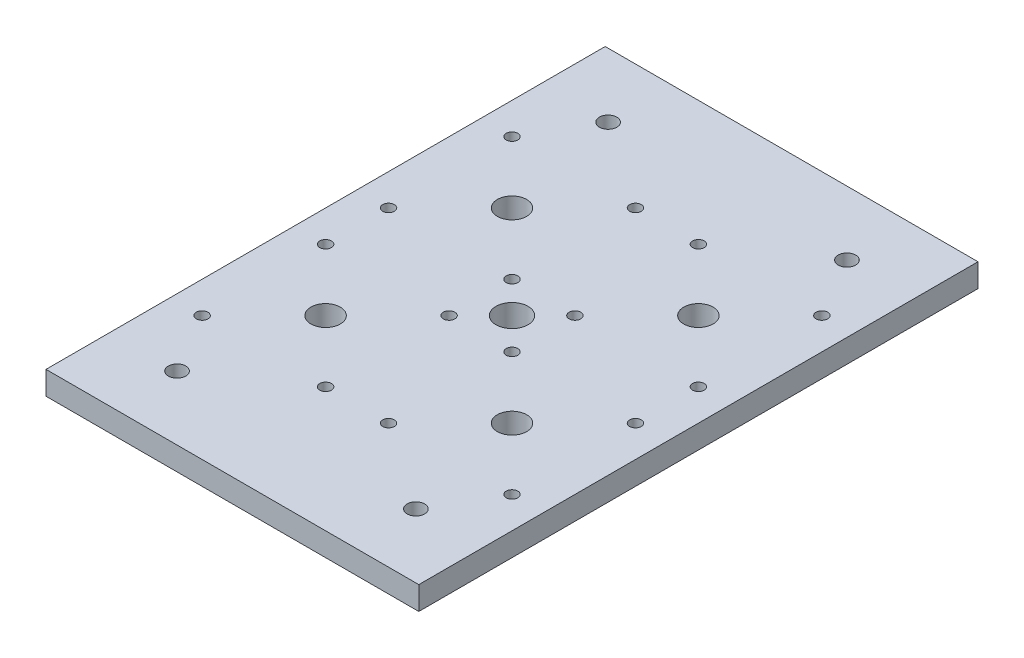
ISO-10303-21;
HEADER;
FILE_DESCRIPTION(('STEP AP214'),'2;1');
FILE_NAME('part.step','',(''),(''),'','','');
FILE_SCHEMA(('AUTOMOTIVE_DESIGN { 1 0 10303 214 1 1 1 1 }'));
ENDSEC;
DATA;
#1=APPLICATION_CONTEXT('core data for automotive mechanical design processes');
#2=APPLICATION_PROTOCOL_DEFINITION('international standard','automotive_design',2000,#1);
#3=PRODUCT_CONTEXT('',#1,'mechanical');
#4=PRODUCT('Part','Part','',(#3));
#5=PRODUCT_RELATED_PRODUCT_CATEGORY('part','',(#4));
#6=PRODUCT_DEFINITION_FORMATION('','',#4);
#7=PRODUCT_DEFINITION_CONTEXT('part definition',#1,'design');
#8=PRODUCT_DEFINITION('design','',#6,#7);
#9=PRODUCT_DEFINITION_SHAPE('','',#8);
#10=(LENGTH_UNIT() NAMED_UNIT(*) SI_UNIT(.MILLI.,.METRE.));
#11=(NAMED_UNIT(*) PLANE_ANGLE_UNIT() SI_UNIT($,.RADIAN.));
#12=(NAMED_UNIT(*) SI_UNIT($,.STERADIAN.) SOLID_ANGLE_UNIT());
#13=UNCERTAINTY_MEASURE_WITH_UNIT(LENGTH_MEASURE(1.E-05),#10,'distance_accuracy_value','');
#14=(GEOMETRIC_REPRESENTATION_CONTEXT(3) GLOBAL_UNCERTAINTY_ASSIGNED_CONTEXT((#13)) GLOBAL_UNIT_ASSIGNED_CONTEXT((#10,
#11,#12)) REPRESENTATION_CONTEXT('',''));
#15=CARTESIAN_POINT('',(0.,0.,0.));
#16=DIRECTION('',(0.,0.,1.));
#17=DIRECTION('',(1.,0.,0.));
#18=AXIS2_PLACEMENT_3D('',#15,#16,#17);
#19=CARTESIAN_POINT('',(0.,6.35,0.));
#20=DIRECTION('',(0.,1.,0.));
#21=DIRECTION('',(0.,0.,1.));
#22=AXIS2_PLACEMENT_3D('',#19,#20,#21);
#23=PLANE('',#22);
#24=CARTESIAN_POINT('',(-32.54375,6.35,58.7375));
#25=DIRECTION('',(0.,1.,0.));
#26=DIRECTION('',(0.,0.,1.));
#27=AXIS2_PLACEMENT_3D('',#24,#25,#26);
#28=CIRCLE('',#27,2.38125);
#29=CARTESIAN_POINT('',(-32.54375,6.35,61.11875));
#30=VERTEX_POINT('',#29);
#31=EDGE_CURVE('E247',#30,#30,#28,.T.);
#32=ORIENTED_EDGE('',*,*,#31,.F.);
#33=EDGE_LOOP('',(#32));
#34=FACE_BOUND('',#33,.T.);
#35=CARTESIAN_POINT('',(32.54375,6.35,-58.7375));
#36=DIRECTION('',(0.,1.,0.));
#37=DIRECTION('',(0.,0.,1.));
#38=AXIS2_PLACEMENT_3D('',#35,#36,#37);
#39=CIRCLE('',#38,2.38125);
#40=CARTESIAN_POINT('',(32.54375,6.35,-56.35625));
#41=VERTEX_POINT('',#40);
#42=EDGE_CURVE('E235',#41,#41,#39,.T.);
#43=ORIENTED_EDGE('',*,*,#42,.F.);
#44=EDGE_LOOP('',(#43));
#45=FACE_BOUND('',#44,.T.);
#46=CARTESIAN_POINT('',(-42.225,6.35,42.225));
#47=DIRECTION('',(0.,1.,0.));
#48=DIRECTION('',(0.,0.,-1.));
#49=AXIS2_PLACEMENT_3D('',#46,#47,#48);
#50=CIRCLE('',#49,1.5875);
#51=CARTESIAN_POINT('',(-42.225,6.35,40.6375));
#52=VERTEX_POINT('',#51);
#53=EDGE_CURVE('E223',#52,#52,#50,.T.);
#54=ORIENTED_EDGE('',*,*,#53,.F.);
#55=EDGE_LOOP('',(#54));
#56=FACE_BOUND('',#55,.T.);
#57=CARTESIAN_POINT('',(-8.57499999999998,6.35,42.225));
#58=DIRECTION('',(0.,1.,0.));
#59=DIRECTION('',(0.,0.,1.));
#60=AXIS2_PLACEMENT_3D('',#57,#58,#59);
#61=CIRCLE('',#60,1.5875);
#62=CARTESIAN_POINT('',(-8.57499999999998,6.35,43.8125));
#63=VERTEX_POINT('',#62);
#64=EDGE_CURVE('E211',#63,#63,#61,.T.);
#65=ORIENTED_EDGE('',*,*,#64,.F.);
#66=EDGE_LOOP('',(#65));
#67=FACE_BOUND('',#66,.T.);
#68=CARTESIAN_POINT('',(-8.57499999999999,6.35,8.57500000000001));
#69=DIRECTION('',(0.,1.,0.));
#70=DIRECTION('',(0.,0.,-1.));
#71=AXIS2_PLACEMENT_3D('',#68,#69,#70);
#72=CIRCLE('',#71,1.5875);
#73=CARTESIAN_POINT('',(-8.57499999999999,6.35,6.98750000000001));
#74=VERTEX_POINT('',#73);
#75=EDGE_CURVE('E199',#74,#74,#72,.T.);
#76=ORIENTED_EDGE('',*,*,#75,.F.);
#77=EDGE_LOOP('',(#76));
#78=FACE_BOUND('',#77,.T.);
#79=CARTESIAN_POINT('',(25.4,6.35,25.4));
#80=DIRECTION('',(0.,1.,0.));
#81=DIRECTION('',(0.,0.,1.));
#82=AXIS2_PLACEMENT_3D('',#79,#80,#81);
#83=CIRCLE('',#82,4.);
#84=CARTESIAN_POINT('',(25.4,6.35,29.4));
#85=VERTEX_POINT('',#84);
#86=EDGE_CURVE('E187',#85,#85,#83,.T.);
#87=ORIENTED_EDGE('',*,*,#86,.F.);
#88=EDGE_LOOP('',(#87));
#89=FACE_BOUND('',#88,.T.);
#90=CARTESIAN_POINT('',(42.225,6.35,42.225));
#91=DIRECTION('',(0.,1.,0.));
#92=DIRECTION('',(0.,0.,1.));
#93=AXIS2_PLACEMENT_3D('',#90,#91,#92);
#94=CIRCLE('',#93,1.5875);
#95=CARTESIAN_POINT('',(42.225,6.35,43.8125));
#96=VERTEX_POINT('',#95);
#97=EDGE_CURVE('E175',#96,#96,#94,.T.);
#98=ORIENTED_EDGE('',*,*,#97,.F.);
#99=EDGE_LOOP('',(#98));
#100=FACE_BOUND('',#99,.T.);
#101=CARTESIAN_POINT('',(25.4,6.35,-25.4));
#102=DIRECTION('',(0.,1.,0.));
#103=DIRECTION('',(0.,0.,-1.));
#104=AXIS2_PLACEMENT_3D('',#101,#102,#103);
#105=CIRCLE('',#104,4.);
#106=CARTESIAN_POINT('',(25.4,6.35,-29.4));
#107=VERTEX_POINT('',#106);
#108=EDGE_CURVE('E163',#107,#107,#105,.T.);
#109=ORIENTED_EDGE('',*,*,#108,.F.);
#110=EDGE_LOOP('',(#109));
#111=FACE_BOUND('',#110,.T.);
#112=CARTESIAN_POINT('',(42.225,6.35,-42.225));
#113=DIRECTION('',(0.,1.,0.));
#114=DIRECTION('',(0.,0.,-1.));
#115=AXIS2_PLACEMENT_3D('',#112,#113,#114);
#116=CIRCLE('',#115,1.5875);
#117=CARTESIAN_POINT('',(42.225,6.35,-43.8125));
#118=VERTEX_POINT('',#117);
#119=EDGE_CURVE('E151',#118,#118,#116,.T.);
#120=ORIENTED_EDGE('',*,*,#119,.F.);
#121=EDGE_LOOP('',(#120));
#122=FACE_BOUND('',#121,.T.);
#123=CARTESIAN_POINT('',(8.57500000000001,6.35,-8.57500000000001));
#124=DIRECTION('',(0.,1.,0.));
#125=DIRECTION('',(0.,0.,-1.));
#126=AXIS2_PLACEMENT_3D('',#123,#124,#125);
#127=CIRCLE('',#126,1.5875);
#128=CARTESIAN_POINT('',(8.57500000000001,6.35,-10.1625));
#129=VERTEX_POINT('',#128);
#130=EDGE_CURVE('E139',#129,#129,#127,.T.);
#131=ORIENTED_EDGE('',*,*,#130,.F.);
#132=EDGE_LOOP('',(#131));
#133=FACE_BOUND('',#132,.T.);
#134=CARTESIAN_POINT('',(-8.57499999999999,6.35,-8.57500000000001));
#135=DIRECTION('',(0.,1.,0.));
#136=DIRECTION('',(0.,0.,1.));
#137=AXIS2_PLACEMENT_3D('',#134,#135,#136);
#138=CIRCLE('',#137,1.5875);
#139=CARTESIAN_POINT('',(-8.57499999999999,6.35,-6.98750000000001));
#140=VERTEX_POINT('',#139);
#141=EDGE_CURVE('E127',#140,#140,#138,.T.);
#142=ORIENTED_EDGE('',*,*,#141,.F.);
#143=EDGE_LOOP('',(#142));
#144=FACE_BOUND('',#143,.T.);
#145=CARTESIAN_POINT('',(-42.225,6.35,-42.225));
#146=DIRECTION('',(0.,1.,0.));
#147=DIRECTION('',(0.,0.,1.));
#148=AXIS2_PLACEMENT_3D('',#145,#146,#147);
#149=CIRCLE('',#148,1.5875);
#150=CARTESIAN_POINT('',(-42.225,6.35,-40.6375));
#151=VERTEX_POINT('',#150);
#152=EDGE_CURVE('E115',#151,#151,#149,.T.);
#153=ORIENTED_EDGE('',*,*,#152,.F.);
#154=EDGE_LOOP('',(#153));
#155=FACE_BOUND('',#154,.T.);
#156=DIRECTION('',(0.,0.,1.));
#157=VECTOR('',#156,1.);
#158=CARTESIAN_POINT('',(-50.8,6.35,-76.2));
#159=LINE('',#158,#157);
#160=CARTESIAN_POINT('',(-50.8,6.35,-76.2));
#161=VERTEX_POINT('',#160);
#162=CARTESIAN_POINT('',(-50.8,6.35,76.2));
#163=VERTEX_POINT('',#162);
#164=EDGE_CURVE('E85',#161,#163,#159,.T.);
#165=ORIENTED_EDGE('',*,*,#164,.T.);
#166=DIRECTION('',(1.,0.,0.));
#167=VECTOR('',#166,1.);
#168=CARTESIAN_POINT('',(-50.8,6.35,76.2));
#169=LINE('',#168,#167);
#170=CARTESIAN_POINT('',(50.8,6.35,76.2));
#171=VERTEX_POINT('',#170);
#172=EDGE_CURVE('E80',#163,#171,#169,.T.);
#173=ORIENTED_EDGE('',*,*,#172,.T.);
#174=DIRECTION('',(0.,0.,-1.));
#175=VECTOR('',#174,1.);
#176=CARTESIAN_POINT('',(50.8,6.35,-76.2));
#177=LINE('',#176,#175);
#178=CARTESIAN_POINT('',(50.8,6.35,-76.2));
#179=VERTEX_POINT('',#178);
#180=EDGE_CURVE('E83',#171,#179,#177,.T.);
#181=ORIENTED_EDGE('',*,*,#180,.T.);
#182=DIRECTION('',(-1.,0.,0.));
#183=VECTOR('',#182,1.);
#184=CARTESIAN_POINT('',(-50.8,6.35,-76.2));
#185=LINE('',#184,#183);
#186=EDGE_CURVE('E50',#179,#161,#185,.T.);
#187=ORIENTED_EDGE('',*,*,#186,.T.);
#188=EDGE_LOOP('',(#165,#173,#181,#187));
#189=FACE_BOUND('',#188,.T.);
#190=CARTESIAN_POINT('',(-25.4,6.35,-25.4));
#191=DIRECTION('',(0.,1.,0.));
#192=DIRECTION('',(0.,0.,1.));
#193=AXIS2_PLACEMENT_3D('',#190,#191,#192);
#194=CIRCLE('',#193,4.);
#195=CARTESIAN_POINT('',(-25.4,6.35,-21.4));
#196=VERTEX_POINT('',#195);
#197=EDGE_CURVE('E100',#196,#196,#194,.T.);
#198=ORIENTED_EDGE('',*,*,#197,.F.);
#199=EDGE_LOOP('',(#198));
#200=FACE_BOUND('',#199,.T.);
#201=CARTESIAN_POINT('',(-8.57499999999999,6.35,-42.225));
#202=DIRECTION('',(0.,1.,0.));
#203=DIRECTION('',(0.,0.,-1.));
#204=AXIS2_PLACEMENT_3D('',#201,#202,#203);
#205=CIRCLE('',#204,1.5875);
#206=CARTESIAN_POINT('',(-8.57499999999999,6.35,-43.8125));
#207=VERTEX_POINT('',#206);
#208=EDGE_CURVE('E121',#207,#207,#205,.T.);
#209=ORIENTED_EDGE('',*,*,#208,.F.);
#210=EDGE_LOOP('',(#209));
#211=FACE_BOUND('',#210,.T.);
#212=CARTESIAN_POINT('',(-42.225,6.35,-8.57499999999999));
#213=DIRECTION('',(0.,1.,0.));
#214=DIRECTION('',(0.,0.,-1.));
#215=AXIS2_PLACEMENT_3D('',#212,#213,#214);
#216=CIRCLE('',#215,1.5875);
#217=CARTESIAN_POINT('',(-42.225,6.35,-10.1625));
#218=VERTEX_POINT('',#217);
#219=EDGE_CURVE('E133',#218,#218,#216,.T.);
#220=ORIENTED_EDGE('',*,*,#219,.F.);
#221=EDGE_LOOP('',(#220));
#222=FACE_BOUND('',#221,.T.);
#223=CARTESIAN_POINT('',(42.225,6.35,-8.575));
#224=DIRECTION('',(0.,1.,0.));
#225=DIRECTION('',(0.,0.,1.));
#226=AXIS2_PLACEMENT_3D('',#223,#224,#225);
#227=CIRCLE('',#226,1.5875);
#228=CARTESIAN_POINT('',(42.225,6.35,-6.9875));
#229=VERTEX_POINT('',#228);
#230=EDGE_CURVE('E145',#229,#229,#227,.T.);
#231=ORIENTED_EDGE('',*,*,#230,.F.);
#232=EDGE_LOOP('',(#231));
#233=FACE_BOUND('',#232,.T.);
#234=CARTESIAN_POINT('',(8.575,6.35,-42.225));
#235=DIRECTION('',(0.,1.,0.));
#236=DIRECTION('',(0.,0.,1.));
#237=AXIS2_PLACEMENT_3D('',#234,#235,#236);
#238=CIRCLE('',#237,1.5875);
#239=CARTESIAN_POINT('',(8.575,6.35,-40.6375));
#240=VERTEX_POINT('',#239);
#241=EDGE_CURVE('E157',#240,#240,#238,.T.);
#242=ORIENTED_EDGE('',*,*,#241,.F.);
#243=EDGE_LOOP('',(#242));
#244=FACE_BOUND('',#243,.T.);
#245=CARTESIAN_POINT('',(42.225,6.35,8.57499999999999));
#246=DIRECTION('',(0.,1.,0.));
#247=DIRECTION('',(0.,0.,-1.));
#248=AXIS2_PLACEMENT_3D('',#245,#246,#247);
#249=CIRCLE('',#248,1.5875);
#250=CARTESIAN_POINT('',(42.225,6.35,6.98749999999999));
#251=VERTEX_POINT('',#250);
#252=EDGE_CURVE('E169',#251,#251,#249,.T.);
#253=ORIENTED_EDGE('',*,*,#252,.F.);
#254=EDGE_LOOP('',(#253));
#255=FACE_BOUND('',#254,.T.);
#256=CARTESIAN_POINT('',(8.57500000000001,6.35,42.225));
#257=DIRECTION('',(0.,1.,0.));
#258=DIRECTION('',(0.,0.,-1.));
#259=AXIS2_PLACEMENT_3D('',#256,#257,#258);
#260=CIRCLE('',#259,1.5875);
#261=CARTESIAN_POINT('',(8.57500000000001,6.35,40.6375));
#262=VERTEX_POINT('',#261);
#263=EDGE_CURVE('E181',#262,#262,#260,.T.);
#264=ORIENTED_EDGE('',*,*,#263,.F.);
#265=EDGE_LOOP('',(#264));
#266=FACE_BOUND('',#265,.T.);
#267=CARTESIAN_POINT('',(8.57500000000001,6.35,8.575));
#268=DIRECTION('',(0.,1.,0.));
#269=DIRECTION('',(0.,0.,1.));
#270=AXIS2_PLACEMENT_3D('',#267,#268,#269);
#271=CIRCLE('',#270,1.5875);
#272=CARTESIAN_POINT('',(8.57500000000001,6.35,10.1625));
#273=VERTEX_POINT('',#272);
#274=EDGE_CURVE('E193',#273,#273,#271,.T.);
#275=ORIENTED_EDGE('',*,*,#274,.F.);
#276=EDGE_LOOP('',(#275));
#277=FACE_BOUND('',#276,.T.);
#278=CARTESIAN_POINT('',(-42.225,6.35,8.575));
#279=DIRECTION('',(0.,1.,0.));
#280=DIRECTION('',(0.,0.,1.));
#281=AXIS2_PLACEMENT_3D('',#278,#279,#280);
#282=CIRCLE('',#281,1.5875);
#283=CARTESIAN_POINT('',(-42.225,6.35,10.1625));
#284=VERTEX_POINT('',#283);
#285=EDGE_CURVE('E205',#284,#284,#282,.T.);
#286=ORIENTED_EDGE('',*,*,#285,.F.);
#287=EDGE_LOOP('',(#286));
#288=FACE_BOUND('',#287,.T.);
#289=CARTESIAN_POINT('',(-25.4,6.35,25.4));
#290=DIRECTION('',(0.,1.,0.));
#291=DIRECTION('',(0.,0.,-1.));
#292=AXIS2_PLACEMENT_3D('',#289,#290,#291);
#293=CIRCLE('',#292,4.);
#294=CARTESIAN_POINT('',(-25.4,6.35,21.4));
#295=VERTEX_POINT('',#294);
#296=EDGE_CURVE('E217',#295,#295,#293,.T.);
#297=ORIENTED_EDGE('',*,*,#296,.F.);
#298=EDGE_LOOP('',(#297));
#299=FACE_BOUND('',#298,.T.);
#300=CARTESIAN_POINT('',(0.,6.35,0.));
#301=DIRECTION('',(0.,1.,0.));
#302=DIRECTION('',(0.,0.,1.));
#303=AXIS2_PLACEMENT_3D('',#300,#301,#302);
#304=CIRCLE('',#303,4.365625);
#305=CARTESIAN_POINT('',(0.,6.35,4.365625));
#306=VERTEX_POINT('',#305);
#307=EDGE_CURVE('E229',#306,#306,#304,.T.);
#308=ORIENTED_EDGE('',*,*,#307,.F.);
#309=EDGE_LOOP('',(#308));
#310=FACE_BOUND('',#309,.T.);
#311=CARTESIAN_POINT('',(32.54375,6.35,58.7375));
#312=DIRECTION('',(0.,1.,0.));
#313=DIRECTION('',(0.,0.,-1.));
#314=AXIS2_PLACEMENT_3D('',#311,#312,#313);
#315=CIRCLE('',#314,2.38125);
#316=CARTESIAN_POINT('',(32.54375,6.35,56.35625));
#317=VERTEX_POINT('',#316);
#318=EDGE_CURVE('E241',#317,#317,#315,.T.);
#319=ORIENTED_EDGE('',*,*,#318,.F.);
#320=EDGE_LOOP('',(#319));
#321=FACE_BOUND('',#320,.T.);
#322=CARTESIAN_POINT('',(-32.54375,6.35,-58.7375));
#323=DIRECTION('',(0.,1.,0.));
#324=DIRECTION('',(0.,0.,-1.));
#325=AXIS2_PLACEMENT_3D('',#322,#323,#324);
#326=CIRCLE('',#325,2.38125);
#327=CARTESIAN_POINT('',(-32.54375,6.35,-61.11875));
#328=VERTEX_POINT('',#327);
#329=EDGE_CURVE('E253',#328,#328,#326,.T.);
#330=ORIENTED_EDGE('',*,*,#329,.F.);
#331=EDGE_LOOP('',(#330));
#332=FACE_BOUND('',#331,.T.);
#333=ADVANCED_FACE('F33',(#34,#45,#56,#67,#78,#89,#100,#111,#122,#133,#144,#155,#189,#200,#211,
#222,#233,#244,#255,#266,#277,#288,#299,#310,#321,#332),#23,.T.);
#334=CARTESIAN_POINT('',(0.,0.,0.));
#335=DIRECTION('',(0.,1.,0.));
#336=DIRECTION('',(0.,0.,1.));
#337=AXIS2_PLACEMENT_3D('',#334,#335,#336);
#338=PLANE('',#337);
#339=DIRECTION('',(0.,0.,1.));
#340=VECTOR('',#339,1.);
#341=CARTESIAN_POINT('',(-50.8,0.,-76.2));
#342=LINE('',#341,#340);
#343=CARTESIAN_POINT('',(-50.8,0.,-76.2));
#344=VERTEX_POINT('',#343);
#345=CARTESIAN_POINT('',(-50.8,0.,76.2));
#346=VERTEX_POINT('',#345);
#347=EDGE_CURVE('E97',#344,#346,#342,.T.);
#348=ORIENTED_EDGE('',*,*,#347,.F.);
#349=DIRECTION('',(-1.,0.,0.));
#350=VECTOR('',#349,1.);
#351=CARTESIAN_POINT('',(-50.8,0.,-76.2));
#352=LINE('',#351,#350);
#353=CARTESIAN_POINT('',(50.8,0.,-76.2));
#354=VERTEX_POINT('',#353);
#355=EDGE_CURVE('E73',#354,#344,#352,.T.);
#356=ORIENTED_EDGE('',*,*,#355,.F.);
#357=DIRECTION('',(0.,0.,-1.));
#358=VECTOR('',#357,1.);
#359=CARTESIAN_POINT('',(50.8,0.,-76.2));
#360=LINE('',#359,#358);
#361=CARTESIAN_POINT('',(50.8,0.,76.2));
#362=VERTEX_POINT('',#361);
#363=EDGE_CURVE('E67',#362,#354,#360,.T.);
#364=ORIENTED_EDGE('',*,*,#363,.F.);
#365=DIRECTION('',(1.,0.,0.));
#366=VECTOR('',#365,1.);
#367=CARTESIAN_POINT('',(-50.8,0.,76.2));
#368=LINE('',#367,#366);
#369=EDGE_CURVE('E89',#346,#362,#368,.T.);
#370=ORIENTED_EDGE('',*,*,#369,.F.);
#371=EDGE_LOOP('',(#348,#356,#364,#370));
#372=FACE_BOUND('',#371,.T.);
#373=CARTESIAN_POINT('',(-25.4,0.,-25.4));
#374=DIRECTION('',(0.,1.,0.));
#375=DIRECTION('',(0.,0.,1.));
#376=AXIS2_PLACEMENT_3D('',#373,#374,#375);
#377=CIRCLE('',#376,4.);
#378=CARTESIAN_POINT('',(-25.4,0.,-21.4));
#379=VERTEX_POINT('',#378);
#380=EDGE_CURVE('E112',#379,#379,#377,.T.);
#381=ORIENTED_EDGE('',*,*,#380,.T.);
#382=EDGE_LOOP('',(#381));
#383=FACE_BOUND('',#382,.T.);
#384=CARTESIAN_POINT('',(-42.225,0.,-42.225));
#385=DIRECTION('',(0.,1.,0.));
#386=DIRECTION('',(0.,0.,1.));
#387=AXIS2_PLACEMENT_3D('',#384,#385,#386);
#388=CIRCLE('',#387,1.5875);
#389=CARTESIAN_POINT('',(-42.225,0.,-40.6375));
#390=VERTEX_POINT('',#389);
#391=EDGE_CURVE('E118',#390,#390,#388,.T.);
#392=ORIENTED_EDGE('',*,*,#391,.T.);
#393=EDGE_LOOP('',(#392));
#394=FACE_BOUND('',#393,.T.);
#395=CARTESIAN_POINT('',(-8.57499999999999,0.,-42.225));
#396=DIRECTION('',(0.,1.,0.));
#397=DIRECTION('',(0.,0.,-1.));
#398=AXIS2_PLACEMENT_3D('',#395,#396,#397);
#399=CIRCLE('',#398,1.5875);
#400=CARTESIAN_POINT('',(-8.57499999999999,0.,-43.8125));
#401=VERTEX_POINT('',#400);
#402=EDGE_CURVE('E124',#401,#401,#399,.T.);
#403=ORIENTED_EDGE('',*,*,#402,.T.);
#404=EDGE_LOOP('',(#403));
#405=FACE_BOUND('',#404,.T.);
#406=CARTESIAN_POINT('',(-8.57499999999999,0.,-8.57500000000001));
#407=DIRECTION('',(0.,1.,0.));
#408=DIRECTION('',(0.,0.,1.));
#409=AXIS2_PLACEMENT_3D('',#406,#407,#408);
#410=CIRCLE('',#409,1.5875);
#411=CARTESIAN_POINT('',(-8.57499999999999,0.,-6.98750000000001));
#412=VERTEX_POINT('',#411);
#413=EDGE_CURVE('E130',#412,#412,#410,.T.);
#414=ORIENTED_EDGE('',*,*,#413,.T.);
#415=EDGE_LOOP('',(#414));
#416=FACE_BOUND('',#415,.T.);
#417=CARTESIAN_POINT('',(-42.225,0.,-8.57499999999999));
#418=DIRECTION('',(0.,1.,0.));
#419=DIRECTION('',(0.,0.,-1.));
#420=AXIS2_PLACEMENT_3D('',#417,#418,#419);
#421=CIRCLE('',#420,1.5875);
#422=CARTESIAN_POINT('',(-42.225,0.,-10.1625));
#423=VERTEX_POINT('',#422);
#424=EDGE_CURVE('E136',#423,#423,#421,.T.);
#425=ORIENTED_EDGE('',*,*,#424,.T.);
#426=EDGE_LOOP('',(#425));
#427=FACE_BOUND('',#426,.T.);
#428=CARTESIAN_POINT('',(8.57500000000001,0.,-8.57500000000001));
#429=DIRECTION('',(0.,1.,0.));
#430=DIRECTION('',(0.,0.,-1.));
#431=AXIS2_PLACEMENT_3D('',#428,#429,#430);
#432=CIRCLE('',#431,1.5875);
#433=CARTESIAN_POINT('',(8.57500000000001,0.,-10.1625));
#434=VERTEX_POINT('',#433);
#435=EDGE_CURVE('E142',#434,#434,#432,.T.);
#436=ORIENTED_EDGE('',*,*,#435,.T.);
#437=EDGE_LOOP('',(#436));
#438=FACE_BOUND('',#437,.T.);
#439=CARTESIAN_POINT('',(42.225,0.,-8.575));
#440=DIRECTION('',(0.,1.,0.));
#441=DIRECTION('',(0.,0.,1.));
#442=AXIS2_PLACEMENT_3D('',#439,#440,#441);
#443=CIRCLE('',#442,1.5875);
#444=CARTESIAN_POINT('',(42.225,0.,-6.9875));
#445=VERTEX_POINT('',#444);
#446=EDGE_CURVE('E148',#445,#445,#443,.T.);
#447=ORIENTED_EDGE('',*,*,#446,.T.);
#448=EDGE_LOOP('',(#447));
#449=FACE_BOUND('',#448,.T.);
#450=CARTESIAN_POINT('',(42.225,0.,-42.225));
#451=DIRECTION('',(0.,1.,0.));
#452=DIRECTION('',(0.,0.,-1.));
#453=AXIS2_PLACEMENT_3D('',#450,#451,#452);
#454=CIRCLE('',#453,1.5875);
#455=CARTESIAN_POINT('',(42.225,0.,-43.8125));
#456=VERTEX_POINT('',#455);
#457=EDGE_CURVE('E154',#456,#456,#454,.T.);
#458=ORIENTED_EDGE('',*,*,#457,.T.);
#459=EDGE_LOOP('',(#458));
#460=FACE_BOUND('',#459,.T.);
#461=CARTESIAN_POINT('',(8.575,0.,-42.225));
#462=DIRECTION('',(0.,1.,0.));
#463=DIRECTION('',(0.,0.,1.));
#464=AXIS2_PLACEMENT_3D('',#461,#462,#463);
#465=CIRCLE('',#464,1.5875);
#466=CARTESIAN_POINT('',(8.575,0.,-40.6375));
#467=VERTEX_POINT('',#466);
#468=EDGE_CURVE('E160',#467,#467,#465,.T.);
#469=ORIENTED_EDGE('',*,*,#468,.T.);
#470=EDGE_LOOP('',(#469));
#471=FACE_BOUND('',#470,.T.);
#472=CARTESIAN_POINT('',(25.4,0.,-25.4));
#473=DIRECTION('',(0.,1.,0.));
#474=DIRECTION('',(0.,0.,-1.));
#475=AXIS2_PLACEMENT_3D('',#472,#473,#474);
#476=CIRCLE('',#475,4.);
#477=CARTESIAN_POINT('',(25.4,0.,-29.4));
#478=VERTEX_POINT('',#477);
#479=EDGE_CURVE('E166',#478,#478,#476,.T.);
#480=ORIENTED_EDGE('',*,*,#479,.T.);
#481=EDGE_LOOP('',(#480));
#482=FACE_BOUND('',#481,.T.);
#483=CARTESIAN_POINT('',(42.225,0.,8.57499999999999));
#484=DIRECTION('',(0.,1.,0.));
#485=DIRECTION('',(0.,0.,-1.));
#486=AXIS2_PLACEMENT_3D('',#483,#484,#485);
#487=CIRCLE('',#486,1.5875);
#488=CARTESIAN_POINT('',(42.225,0.,6.98749999999999));
#489=VERTEX_POINT('',#488);
#490=EDGE_CURVE('E172',#489,#489,#487,.T.);
#491=ORIENTED_EDGE('',*,*,#490,.T.);
#492=EDGE_LOOP('',(#491));
#493=FACE_BOUND('',#492,.T.);
#494=CARTESIAN_POINT('',(42.225,0.,42.225));
#495=DIRECTION('',(0.,1.,0.));
#496=DIRECTION('',(0.,0.,1.));
#497=AXIS2_PLACEMENT_3D('',#494,#495,#496);
#498=CIRCLE('',#497,1.5875);
#499=CARTESIAN_POINT('',(42.225,0.,43.8125));
#500=VERTEX_POINT('',#499);
#501=EDGE_CURVE('E178',#500,#500,#498,.T.);
#502=ORIENTED_EDGE('',*,*,#501,.T.);
#503=EDGE_LOOP('',(#502));
#504=FACE_BOUND('',#503,.T.);
#505=CARTESIAN_POINT('',(8.57500000000001,0.,42.225));
#506=DIRECTION('',(0.,1.,0.));
#507=DIRECTION('',(0.,0.,-1.));
#508=AXIS2_PLACEMENT_3D('',#505,#506,#507);
#509=CIRCLE('',#508,1.5875);
#510=CARTESIAN_POINT('',(8.57500000000001,0.,40.6375));
#511=VERTEX_POINT('',#510);
#512=EDGE_CURVE('E184',#511,#511,#509,.T.);
#513=ORIENTED_EDGE('',*,*,#512,.T.);
#514=EDGE_LOOP('',(#513));
#515=FACE_BOUND('',#514,.T.);
#516=CARTESIAN_POINT('',(25.4,0.,25.4));
#517=DIRECTION('',(0.,1.,0.));
#518=DIRECTION('',(0.,0.,1.));
#519=AXIS2_PLACEMENT_3D('',#516,#517,#518);
#520=CIRCLE('',#519,4.);
#521=CARTESIAN_POINT('',(25.4,0.,29.4));
#522=VERTEX_POINT('',#521);
#523=EDGE_CURVE('E190',#522,#522,#520,.T.);
#524=ORIENTED_EDGE('',*,*,#523,.T.);
#525=EDGE_LOOP('',(#524));
#526=FACE_BOUND('',#525,.T.);
#527=CARTESIAN_POINT('',(8.57500000000001,0.,8.575));
#528=DIRECTION('',(0.,1.,0.));
#529=DIRECTION('',(0.,0.,1.));
#530=AXIS2_PLACEMENT_3D('',#527,#528,#529);
#531=CIRCLE('',#530,1.5875);
#532=CARTESIAN_POINT('',(8.57500000000001,0.,10.1625));
#533=VERTEX_POINT('',#532);
#534=EDGE_CURVE('E196',#533,#533,#531,.T.);
#535=ORIENTED_EDGE('',*,*,#534,.T.);
#536=EDGE_LOOP('',(#535));
#537=FACE_BOUND('',#536,.T.);
#538=CARTESIAN_POINT('',(-8.57499999999999,0.,8.57500000000001));
#539=DIRECTION('',(0.,1.,0.));
#540=DIRECTION('',(0.,0.,-1.));
#541=AXIS2_PLACEMENT_3D('',#538,#539,#540);
#542=CIRCLE('',#541,1.5875);
#543=CARTESIAN_POINT('',(-8.57499999999999,0.,6.98750000000001));
#544=VERTEX_POINT('',#543);
#545=EDGE_CURVE('E202',#544,#544,#542,.T.);
#546=ORIENTED_EDGE('',*,*,#545,.T.);
#547=EDGE_LOOP('',(#546));
#548=FACE_BOUND('',#547,.T.);
#549=CARTESIAN_POINT('',(-42.225,0.,8.575));
#550=DIRECTION('',(0.,1.,0.));
#551=DIRECTION('',(0.,0.,1.));
#552=AXIS2_PLACEMENT_3D('',#549,#550,#551);
#553=CIRCLE('',#552,1.5875);
#554=CARTESIAN_POINT('',(-42.225,0.,10.1625));
#555=VERTEX_POINT('',#554);
#556=EDGE_CURVE('E208',#555,#555,#553,.T.);
#557=ORIENTED_EDGE('',*,*,#556,.T.);
#558=EDGE_LOOP('',(#557));
#559=FACE_BOUND('',#558,.T.);
#560=CARTESIAN_POINT('',(-8.57499999999998,0.,42.225));
#561=DIRECTION('',(0.,1.,0.));
#562=DIRECTION('',(0.,0.,1.));
#563=AXIS2_PLACEMENT_3D('',#560,#561,#562);
#564=CIRCLE('',#563,1.5875);
#565=CARTESIAN_POINT('',(-8.57499999999998,0.,43.8125));
#566=VERTEX_POINT('',#565);
#567=EDGE_CURVE('E214',#566,#566,#564,.T.);
#568=ORIENTED_EDGE('',*,*,#567,.T.);
#569=EDGE_LOOP('',(#568));
#570=FACE_BOUND('',#569,.T.);
#571=CARTESIAN_POINT('',(-25.4,0.,25.4));
#572=DIRECTION('',(0.,1.,0.));
#573=DIRECTION('',(0.,0.,-1.));
#574=AXIS2_PLACEMENT_3D('',#571,#572,#573);
#575=CIRCLE('',#574,4.);
#576=CARTESIAN_POINT('',(-25.4,0.,21.4));
#577=VERTEX_POINT('',#576);
#578=EDGE_CURVE('E220',#577,#577,#575,.T.);
#579=ORIENTED_EDGE('',*,*,#578,.T.);
#580=EDGE_LOOP('',(#579));
#581=FACE_BOUND('',#580,.T.);
#582=CARTESIAN_POINT('',(-42.225,0.,42.225));
#583=DIRECTION('',(0.,1.,0.));
#584=DIRECTION('',(0.,0.,-1.));
#585=AXIS2_PLACEMENT_3D('',#582,#583,#584);
#586=CIRCLE('',#585,1.5875);
#587=CARTESIAN_POINT('',(-42.225,0.,40.6375));
#588=VERTEX_POINT('',#587);
#589=EDGE_CURVE('E226',#588,#588,#586,.T.);
#590=ORIENTED_EDGE('',*,*,#589,.T.);
#591=EDGE_LOOP('',(#590));
#592=FACE_BOUND('',#591,.T.);
#593=CARTESIAN_POINT('',(0.,0.,0.));
#594=DIRECTION('',(0.,1.,0.));
#595=DIRECTION('',(0.,0.,1.));
#596=AXIS2_PLACEMENT_3D('',#593,#594,#595);
#597=CIRCLE('',#596,4.365625);
#598=CARTESIAN_POINT('',(0.,0.,4.365625));
#599=VERTEX_POINT('',#598);
#600=EDGE_CURVE('E232',#599,#599,#597,.T.);
#601=ORIENTED_EDGE('',*,*,#600,.T.);
#602=EDGE_LOOP('',(#601));
#603=FACE_BOUND('',#602,.T.);
#604=CARTESIAN_POINT('',(32.54375,0.,-58.7375));
#605=DIRECTION('',(0.,1.,0.));
#606=DIRECTION('',(0.,0.,1.));
#607=AXIS2_PLACEMENT_3D('',#604,#605,#606);
#608=CIRCLE('',#607,2.38125);
#609=CARTESIAN_POINT('',(32.54375,0.,-56.35625));
#610=VERTEX_POINT('',#609);
#611=EDGE_CURVE('E238',#610,#610,#608,.T.);
#612=ORIENTED_EDGE('',*,*,#611,.T.);
#613=EDGE_LOOP('',(#612));
#614=FACE_BOUND('',#613,.T.);
#615=CARTESIAN_POINT('',(32.54375,0.,58.7375));
#616=DIRECTION('',(0.,1.,0.));
#617=DIRECTION('',(0.,0.,-1.));
#618=AXIS2_PLACEMENT_3D('',#615,#616,#617);
#619=CIRCLE('',#618,2.38125);
#620=CARTESIAN_POINT('',(32.54375,0.,56.35625));
#621=VERTEX_POINT('',#620);
#622=EDGE_CURVE('E244',#621,#621,#619,.T.);
#623=ORIENTED_EDGE('',*,*,#622,.T.);
#624=EDGE_LOOP('',(#623));
#625=FACE_BOUND('',#624,.T.);
#626=CARTESIAN_POINT('',(-32.54375,0.,58.7375));
#627=DIRECTION('',(0.,1.,0.));
#628=DIRECTION('',(0.,0.,1.));
#629=AXIS2_PLACEMENT_3D('',#626,#627,#628);
#630=CIRCLE('',#629,2.38125);
#631=CARTESIAN_POINT('',(-32.54375,0.,61.11875));
#632=VERTEX_POINT('',#631);
#633=EDGE_CURVE('E250',#632,#632,#630,.T.);
#634=ORIENTED_EDGE('',*,*,#633,.T.);
#635=EDGE_LOOP('',(#634));
#636=FACE_BOUND('',#635,.T.);
#637=CARTESIAN_POINT('',(-32.54375,0.,-58.7375));
#638=DIRECTION('',(0.,1.,0.));
#639=DIRECTION('',(0.,0.,-1.));
#640=AXIS2_PLACEMENT_3D('',#637,#638,#639);
#641=CIRCLE('',#640,2.38125);
#642=CARTESIAN_POINT('',(-32.54375,0.,-61.11875));
#643=VERTEX_POINT('',#642);
#644=EDGE_CURVE('E256',#643,#643,#641,.T.);
#645=ORIENTED_EDGE('',*,*,#644,.T.);
#646=EDGE_LOOP('',(#645));
#647=FACE_BOUND('',#646,.T.);
#648=ADVANCED_FACE('F108',(#372,#383,#394,#405,#416,#427,#438,#449,#460,#471,#482,#493,#504,
#515,#526,#537,#548,#559,#570,#581,#592,#603,#614,#625,#636,#647),#338,.F.);
#649=CARTESIAN_POINT('',(-50.8,6.35,-76.2));
#650=DIRECTION('',(1.,0.,0.));
#651=DIRECTION('',(0.,0.,-1.));
#652=AXIS2_PLACEMENT_3D('',#649,#650,#651);
#653=PLANE('',#652);
#654=ORIENTED_EDGE('',*,*,#347,.T.);
#655=DIRECTION('',(0.,-1.,0.));
#656=VECTOR('',#655,1.);
#657=CARTESIAN_POINT('',(-50.8,6.35,76.2));
#658=LINE('',#657,#656);
#659=EDGE_CURVE('E11',#163,#346,#658,.T.);
#660=ORIENTED_EDGE('',*,*,#659,.F.);
#661=ORIENTED_EDGE('',*,*,#164,.F.);
#662=DIRECTION('',(0.,-1.,0.));
#663=VECTOR('',#662,1.);
#664=CARTESIAN_POINT('',(-50.8,6.35,-76.2));
#665=LINE('',#664,#663);
#666=EDGE_CURVE('E93',#161,#344,#665,.T.);
#667=ORIENTED_EDGE('',*,*,#666,.T.);
#668=EDGE_LOOP('',(#654,#660,#661,#667));
#669=FACE_BOUND('',#668,.T.);
#670=ADVANCED_FACE('F35',(#669),#653,.F.);
#671=CARTESIAN_POINT('',(-50.8,6.35,76.2));
#672=DIRECTION('',(0.,0.,-1.));
#673=DIRECTION('',(-1.,0.,0.));
#674=AXIS2_PLACEMENT_3D('',#671,#672,#673);
#675=PLANE('',#674);
#676=ORIENTED_EDGE('',*,*,#369,.T.);
#677=DIRECTION('',(0.,-1.,0.));
#678=VECTOR('',#677,1.);
#679=CARTESIAN_POINT('',(50.8,6.35,76.2));
#680=LINE('',#679,#678);
#681=EDGE_CURVE('E42',#171,#362,#680,.T.);
#682=ORIENTED_EDGE('',*,*,#681,.F.);
#683=ORIENTED_EDGE('',*,*,#172,.F.);
#684=ORIENTED_EDGE('',*,*,#659,.T.);
#685=EDGE_LOOP('',(#676,#682,#683,#684));
#686=FACE_BOUND('',#685,.T.);
#687=ADVANCED_FACE('F88',(#686),#675,.F.);
#688=CARTESIAN_POINT('',(50.8,6.35,-76.2));
#689=DIRECTION('',(-1.,0.,0.));
#690=DIRECTION('',(0.,0.,1.));
#691=AXIS2_PLACEMENT_3D('',#688,#689,#690);
#692=PLANE('',#691);
#693=ORIENTED_EDGE('',*,*,#363,.T.);
#694=DIRECTION('',(0.,-1.,0.));
#695=VECTOR('',#694,1.);
#696=CARTESIAN_POINT('',(50.8,6.35,-76.2));
#697=LINE('',#696,#695);
#698=EDGE_CURVE('E90',#179,#354,#697,.T.);
#699=ORIENTED_EDGE('',*,*,#698,.F.);
#700=ORIENTED_EDGE('',*,*,#180,.F.);
#701=ORIENTED_EDGE('',*,*,#681,.T.);
#702=EDGE_LOOP('',(#693,#699,#700,#701));
#703=FACE_BOUND('',#702,.T.);
#704=ADVANCED_FACE('F91',(#703),#692,.F.);
#705=CARTESIAN_POINT('',(-50.8,6.35,-76.2));
#706=DIRECTION('',(0.,0.,1.));
#707=DIRECTION('',(1.,0.,0.));
#708=AXIS2_PLACEMENT_3D('',#705,#706,#707);
#709=PLANE('',#708);
#710=ORIENTED_EDGE('',*,*,#355,.T.);
#711=ORIENTED_EDGE('',*,*,#666,.F.);
#712=ORIENTED_EDGE('',*,*,#186,.F.);
#713=ORIENTED_EDGE('',*,*,#698,.T.);
#714=EDGE_LOOP('',(#710,#711,#712,#713));
#715=FACE_BOUND('',#714,.T.);
#716=ADVANCED_FACE('F105',(#715),#709,.F.);
#717=CARTESIAN_POINT('',(-25.4,6.35,-25.4));
#718=DIRECTION('',(0.,-1.,0.));
#719=DIRECTION('',(0.,0.,-1.));
#720=AXIS2_PLACEMENT_3D('',#717,#718,#719);
#721=CYLINDRICAL_SURFACE('',#720,4.);
#722=ORIENTED_EDGE('',*,*,#197,.T.);
#723=EDGE_LOOP('',(#722));
#724=FACE_BOUND('',#723,.T.);
#725=ORIENTED_EDGE('',*,*,#380,.F.);
#726=EDGE_LOOP('',(#725));
#727=FACE_BOUND('',#726,.T.);
#728=ADVANCED_FACE('F275',(#724,#727),#721,.F.);
#729=CARTESIAN_POINT('',(-42.225,6.35,-42.225));
#730=DIRECTION('',(0.,-1.,0.));
#731=DIRECTION('',(0.,0.,-1.));
#732=AXIS2_PLACEMENT_3D('',#729,#730,#731);
#733=CYLINDRICAL_SURFACE('',#732,1.5875);
#734=ORIENTED_EDGE('',*,*,#152,.T.);
#735=EDGE_LOOP('',(#734));
#736=FACE_BOUND('',#735,.T.);
#737=ORIENTED_EDGE('',*,*,#391,.F.);
#738=EDGE_LOOP('',(#737));
#739=FACE_BOUND('',#738,.T.);
#740=ADVANCED_FACE('F321',(#736,#739),#733,.F.);
#741=CARTESIAN_POINT('',(-8.57499999999999,6.35,-42.225));
#742=DIRECTION('',(0.,-1.,0.));
#743=DIRECTION('',(0.,0.,-1.));
#744=AXIS2_PLACEMENT_3D('',#741,#742,#743);
#745=CYLINDRICAL_SURFACE('',#744,1.5875);
#746=ORIENTED_EDGE('',*,*,#208,.T.);
#747=EDGE_LOOP('',(#746));
#748=FACE_BOUND('',#747,.T.);
#749=ORIENTED_EDGE('',*,*,#402,.F.);
#750=EDGE_LOOP('',(#749));
#751=FACE_BOUND('',#750,.T.);
#752=ADVANCED_FACE('F329',(#748,#751),#745,.F.);
#753=CARTESIAN_POINT('',(-8.57499999999999,6.35,-8.57500000000001));
#754=DIRECTION('',(0.,-1.,0.));
#755=DIRECTION('',(0.,0.,-1.));
#756=AXIS2_PLACEMENT_3D('',#753,#754,#755);
#757=CYLINDRICAL_SURFACE('',#756,1.5875);
#758=ORIENTED_EDGE('',*,*,#141,.T.);
#759=EDGE_LOOP('',(#758));
#760=FACE_BOUND('',#759,.T.);
#761=ORIENTED_EDGE('',*,*,#413,.F.);
#762=EDGE_LOOP('',(#761));
#763=FACE_BOUND('',#762,.T.);
#764=ADVANCED_FACE('F337',(#760,#763),#757,.F.);
#765=CARTESIAN_POINT('',(-42.225,6.35,-8.57499999999999));
#766=DIRECTION('',(0.,-1.,0.));
#767=DIRECTION('',(0.,0.,-1.));
#768=AXIS2_PLACEMENT_3D('',#765,#766,#767);
#769=CYLINDRICAL_SURFACE('',#768,1.5875);
#770=ORIENTED_EDGE('',*,*,#219,.T.);
#771=EDGE_LOOP('',(#770));
#772=FACE_BOUND('',#771,.T.);
#773=ORIENTED_EDGE('',*,*,#424,.F.);
#774=EDGE_LOOP('',(#773));
#775=FACE_BOUND('',#774,.T.);
#776=ADVANCED_FACE('F346',(#772,#775),#769,.F.);
#777=CARTESIAN_POINT('',(8.57500000000001,6.35,-8.57500000000001));
#778=DIRECTION('',(0.,-1.,0.));
#779=DIRECTION('',(0.,0.,-1.));
#780=AXIS2_PLACEMENT_3D('',#777,#778,#779);
#781=CYLINDRICAL_SURFACE('',#780,1.5875);
#782=ORIENTED_EDGE('',*,*,#130,.T.);
#783=EDGE_LOOP('',(#782));
#784=FACE_BOUND('',#783,.T.);
#785=ORIENTED_EDGE('',*,*,#435,.F.);
#786=EDGE_LOOP('',(#785));
#787=FACE_BOUND('',#786,.T.);
#788=ADVANCED_FACE('F355',(#784,#787),#781,.F.);
#789=CARTESIAN_POINT('',(42.225,6.35,-8.575));
#790=DIRECTION('',(0.,-1.,0.));
#791=DIRECTION('',(0.,0.,-1.));
#792=AXIS2_PLACEMENT_3D('',#789,#790,#791);
#793=CYLINDRICAL_SURFACE('',#792,1.5875);
#794=ORIENTED_EDGE('',*,*,#230,.T.);
#795=EDGE_LOOP('',(#794));
#796=FACE_BOUND('',#795,.T.);
#797=ORIENTED_EDGE('',*,*,#446,.F.);
#798=EDGE_LOOP('',(#797));
#799=FACE_BOUND('',#798,.T.);
#800=ADVANCED_FACE('F364',(#796,#799),#793,.F.);
#801=CARTESIAN_POINT('',(42.225,6.35,-42.225));
#802=DIRECTION('',(0.,-1.,0.));
#803=DIRECTION('',(0.,0.,-1.));
#804=AXIS2_PLACEMENT_3D('',#801,#802,#803);
#805=CYLINDRICAL_SURFACE('',#804,1.5875);
#806=ORIENTED_EDGE('',*,*,#119,.T.);
#807=EDGE_LOOP('',(#806));
#808=FACE_BOUND('',#807,.T.);
#809=ORIENTED_EDGE('',*,*,#457,.F.);
#810=EDGE_LOOP('',(#809));
#811=FACE_BOUND('',#810,.T.);
#812=ADVANCED_FACE('F373',(#808,#811),#805,.F.);
#813=CARTESIAN_POINT('',(8.575,6.35,-42.225));
#814=DIRECTION('',(0.,-1.,0.));
#815=DIRECTION('',(0.,0.,-1.));
#816=AXIS2_PLACEMENT_3D('',#813,#814,#815);
#817=CYLINDRICAL_SURFACE('',#816,1.5875);
#818=ORIENTED_EDGE('',*,*,#241,.T.);
#819=EDGE_LOOP('',(#818));
#820=FACE_BOUND('',#819,.T.);
#821=ORIENTED_EDGE('',*,*,#468,.F.);
#822=EDGE_LOOP('',(#821));
#823=FACE_BOUND('',#822,.T.);
#824=ADVANCED_FACE('F382',(#820,#823),#817,.F.);
#825=CARTESIAN_POINT('',(25.4,6.35,-25.4));
#826=DIRECTION('',(0.,-1.,0.));
#827=DIRECTION('',(0.,0.,-1.));
#828=AXIS2_PLACEMENT_3D('',#825,#826,#827);
#829=CYLINDRICAL_SURFACE('',#828,4.);
#830=ORIENTED_EDGE('',*,*,#108,.T.);
#831=EDGE_LOOP('',(#830));
#832=FACE_BOUND('',#831,.T.);
#833=ORIENTED_EDGE('',*,*,#479,.F.);
#834=EDGE_LOOP('',(#833));
#835=FACE_BOUND('',#834,.T.);
#836=ADVANCED_FACE('F391',(#832,#835),#829,.F.);
#837=CARTESIAN_POINT('',(42.225,6.35,8.57499999999999));
#838=DIRECTION('',(0.,-1.,0.));
#839=DIRECTION('',(0.,0.,-1.));
#840=AXIS2_PLACEMENT_3D('',#837,#838,#839);
#841=CYLINDRICAL_SURFACE('',#840,1.5875);
#842=ORIENTED_EDGE('',*,*,#252,.T.);
#843=EDGE_LOOP('',(#842));
#844=FACE_BOUND('',#843,.T.);
#845=ORIENTED_EDGE('',*,*,#490,.F.);
#846=EDGE_LOOP('',(#845));
#847=FACE_BOUND('',#846,.T.);
#848=ADVANCED_FACE('F400',(#844,#847),#841,.F.);
#849=CARTESIAN_POINT('',(42.225,6.35,42.225));
#850=DIRECTION('',(0.,-1.,0.));
#851=DIRECTION('',(0.,0.,-1.));
#852=AXIS2_PLACEMENT_3D('',#849,#850,#851);
#853=CYLINDRICAL_SURFACE('',#852,1.5875);
#854=ORIENTED_EDGE('',*,*,#97,.T.);
#855=EDGE_LOOP('',(#854));
#856=FACE_BOUND('',#855,.T.);
#857=ORIENTED_EDGE('',*,*,#501,.F.);
#858=EDGE_LOOP('',(#857));
#859=FACE_BOUND('',#858,.T.);
#860=ADVANCED_FACE('F409',(#856,#859),#853,.F.);
#861=CARTESIAN_POINT('',(8.57500000000001,6.35,42.225));
#862=DIRECTION('',(0.,-1.,0.));
#863=DIRECTION('',(0.,0.,-1.));
#864=AXIS2_PLACEMENT_3D('',#861,#862,#863);
#865=CYLINDRICAL_SURFACE('',#864,1.5875);
#866=ORIENTED_EDGE('',*,*,#263,.T.);
#867=EDGE_LOOP('',(#866));
#868=FACE_BOUND('',#867,.T.);
#869=ORIENTED_EDGE('',*,*,#512,.F.);
#870=EDGE_LOOP('',(#869));
#871=FACE_BOUND('',#870,.T.);
#872=ADVANCED_FACE('F418',(#868,#871),#865,.F.);
#873=CARTESIAN_POINT('',(25.4,6.35,25.4));
#874=DIRECTION('',(0.,-1.,0.));
#875=DIRECTION('',(0.,0.,-1.));
#876=AXIS2_PLACEMENT_3D('',#873,#874,#875);
#877=CYLINDRICAL_SURFACE('',#876,4.);
#878=ORIENTED_EDGE('',*,*,#86,.T.);
#879=EDGE_LOOP('',(#878));
#880=FACE_BOUND('',#879,.T.);
#881=ORIENTED_EDGE('',*,*,#523,.F.);
#882=EDGE_LOOP('',(#881));
#883=FACE_BOUND('',#882,.T.);
#884=ADVANCED_FACE('F427',(#880,#883),#877,.F.);
#885=CARTESIAN_POINT('',(8.57500000000001,6.35,8.575));
#886=DIRECTION('',(0.,-1.,0.));
#887=DIRECTION('',(0.,0.,-1.));
#888=AXIS2_PLACEMENT_3D('',#885,#886,#887);
#889=CYLINDRICAL_SURFACE('',#888,1.5875);
#890=ORIENTED_EDGE('',*,*,#274,.T.);
#891=EDGE_LOOP('',(#890));
#892=FACE_BOUND('',#891,.T.);
#893=ORIENTED_EDGE('',*,*,#534,.F.);
#894=EDGE_LOOP('',(#893));
#895=FACE_BOUND('',#894,.T.);
#896=ADVANCED_FACE('F436',(#892,#895),#889,.F.);
#897=CARTESIAN_POINT('',(-8.57499999999999,6.35,8.57500000000001));
#898=DIRECTION('',(0.,-1.,0.));
#899=DIRECTION('',(0.,0.,-1.));
#900=AXIS2_PLACEMENT_3D('',#897,#898,#899);
#901=CYLINDRICAL_SURFACE('',#900,1.5875);
#902=ORIENTED_EDGE('',*,*,#75,.T.);
#903=EDGE_LOOP('',(#902));
#904=FACE_BOUND('',#903,.T.);
#905=ORIENTED_EDGE('',*,*,#545,.F.);
#906=EDGE_LOOP('',(#905));
#907=FACE_BOUND('',#906,.T.);
#908=ADVANCED_FACE('F445',(#904,#907),#901,.F.);
#909=CARTESIAN_POINT('',(-42.225,6.35,8.575));
#910=DIRECTION('',(0.,-1.,0.));
#911=DIRECTION('',(0.,0.,-1.));
#912=AXIS2_PLACEMENT_3D('',#909,#910,#911);
#913=CYLINDRICAL_SURFACE('',#912,1.5875);
#914=ORIENTED_EDGE('',*,*,#285,.T.);
#915=EDGE_LOOP('',(#914));
#916=FACE_BOUND('',#915,.T.);
#917=ORIENTED_EDGE('',*,*,#556,.F.);
#918=EDGE_LOOP('',(#917));
#919=FACE_BOUND('',#918,.T.);
#920=ADVANCED_FACE('F454',(#916,#919),#913,.F.);
#921=CARTESIAN_POINT('',(-8.57499999999998,6.35,42.225));
#922=DIRECTION('',(0.,-1.,0.));
#923=DIRECTION('',(0.,0.,-1.));
#924=AXIS2_PLACEMENT_3D('',#921,#922,#923);
#925=CYLINDRICAL_SURFACE('',#924,1.5875);
#926=ORIENTED_EDGE('',*,*,#64,.T.);
#927=EDGE_LOOP('',(#926));
#928=FACE_BOUND('',#927,.T.);
#929=ORIENTED_EDGE('',*,*,#567,.F.);
#930=EDGE_LOOP('',(#929));
#931=FACE_BOUND('',#930,.T.);
#932=ADVANCED_FACE('F463',(#928,#931),#925,.F.);
#933=CARTESIAN_POINT('',(-25.4,6.35,25.4));
#934=DIRECTION('',(0.,-1.,0.));
#935=DIRECTION('',(0.,0.,-1.));
#936=AXIS2_PLACEMENT_3D('',#933,#934,#935);
#937=CYLINDRICAL_SURFACE('',#936,4.);
#938=ORIENTED_EDGE('',*,*,#296,.T.);
#939=EDGE_LOOP('',(#938));
#940=FACE_BOUND('',#939,.T.);
#941=ORIENTED_EDGE('',*,*,#578,.F.);
#942=EDGE_LOOP('',(#941));
#943=FACE_BOUND('',#942,.T.);
#944=ADVANCED_FACE('F472',(#940,#943),#937,.F.);
#945=CARTESIAN_POINT('',(-42.225,6.35,42.225));
#946=DIRECTION('',(0.,-1.,0.));
#947=DIRECTION('',(0.,0.,-1.));
#948=AXIS2_PLACEMENT_3D('',#945,#946,#947);
#949=CYLINDRICAL_SURFACE('',#948,1.5875);
#950=ORIENTED_EDGE('',*,*,#53,.T.);
#951=EDGE_LOOP('',(#950));
#952=FACE_BOUND('',#951,.T.);
#953=ORIENTED_EDGE('',*,*,#589,.F.);
#954=EDGE_LOOP('',(#953));
#955=FACE_BOUND('',#954,.T.);
#956=ADVANCED_FACE('F481',(#952,#955),#949,.F.);
#957=CARTESIAN_POINT('',(0.,6.35,0.));
#958=DIRECTION('',(0.,-1.,0.));
#959=DIRECTION('',(0.,0.,-1.));
#960=AXIS2_PLACEMENT_3D('',#957,#958,#959);
#961=CYLINDRICAL_SURFACE('',#960,4.365625);
#962=ORIENTED_EDGE('',*,*,#307,.T.);
#963=EDGE_LOOP('',(#962));
#964=FACE_BOUND('',#963,.T.);
#965=ORIENTED_EDGE('',*,*,#600,.F.);
#966=EDGE_LOOP('',(#965));
#967=FACE_BOUND('',#966,.T.);
#968=ADVANCED_FACE('F490',(#964,#967),#961,.F.);
#969=CARTESIAN_POINT('',(32.54375,6.35,-58.7375));
#970=DIRECTION('',(0.,-1.,0.));
#971=DIRECTION('',(0.,0.,-1.));
#972=AXIS2_PLACEMENT_3D('',#969,#970,#971);
#973=CYLINDRICAL_SURFACE('',#972,2.38125);
#974=ORIENTED_EDGE('',*,*,#42,.T.);
#975=EDGE_LOOP('',(#974));
#976=FACE_BOUND('',#975,.T.);
#977=ORIENTED_EDGE('',*,*,#611,.F.);
#978=EDGE_LOOP('',(#977));
#979=FACE_BOUND('',#978,.T.);
#980=ADVANCED_FACE('F499',(#976,#979),#973,.F.);
#981=CARTESIAN_POINT('',(32.54375,6.35,58.7375));
#982=DIRECTION('',(0.,-1.,0.));
#983=DIRECTION('',(0.,0.,-1.));
#984=AXIS2_PLACEMENT_3D('',#981,#982,#983);
#985=CYLINDRICAL_SURFACE('',#984,2.38125);
#986=ORIENTED_EDGE('',*,*,#318,.T.);
#987=EDGE_LOOP('',(#986));
#988=FACE_BOUND('',#987,.T.);
#989=ORIENTED_EDGE('',*,*,#622,.F.);
#990=EDGE_LOOP('',(#989));
#991=FACE_BOUND('',#990,.T.);
#992=ADVANCED_FACE('F508',(#988,#991),#985,.F.);
#993=CARTESIAN_POINT('',(-32.54375,6.35,58.7375));
#994=DIRECTION('',(0.,-1.,0.));
#995=DIRECTION('',(0.,0.,-1.));
#996=AXIS2_PLACEMENT_3D('',#993,#994,#995);
#997=CYLINDRICAL_SURFACE('',#996,2.38125);
#998=ORIENTED_EDGE('',*,*,#31,.T.);
#999=EDGE_LOOP('',(#998));
#1000=FACE_BOUND('',#999,.T.);
#1001=ORIENTED_EDGE('',*,*,#633,.F.);
#1002=EDGE_LOOP('',(#1001));
#1003=FACE_BOUND('',#1002,.T.);
#1004=ADVANCED_FACE('F517',(#1000,#1003),#997,.F.);
#1005=CARTESIAN_POINT('',(-32.54375,6.35,-58.7375));
#1006=DIRECTION('',(0.,-1.,0.));
#1007=DIRECTION('',(0.,0.,-1.));
#1008=AXIS2_PLACEMENT_3D('',#1005,#1006,#1007);
#1009=CYLINDRICAL_SURFACE('',#1008,2.38125);
#1010=ORIENTED_EDGE('',*,*,#329,.T.);
#1011=EDGE_LOOP('',(#1010));
#1012=FACE_BOUND('',#1011,.T.);
#1013=ORIENTED_EDGE('',*,*,#644,.F.);
#1014=EDGE_LOOP('',(#1013));
#1015=FACE_BOUND('',#1014,.T.);
#1016=ADVANCED_FACE('F262',(#1012,#1015),#1009,.F.);
#1017=CLOSED_SHELL('',(#333,#648,#670,#687,#704,#716,#728,#740,#752,#764,#776,#788,#800,#812,
#824,#836,#848,#860,#872,#884,#896,#908,#920,#932,#944,#956,#968,#980,#992,#1004,#1016));
#1018=MANIFOLD_SOLID_BREP('B2',#1017);
#1019=ADVANCED_BREP_SHAPE_REPRESENTATION('',(#18,#1018),#14);
#1020=SHAPE_DEFINITION_REPRESENTATION(#9,#1019);
ENDSEC;
END-ISO-10303-21;
